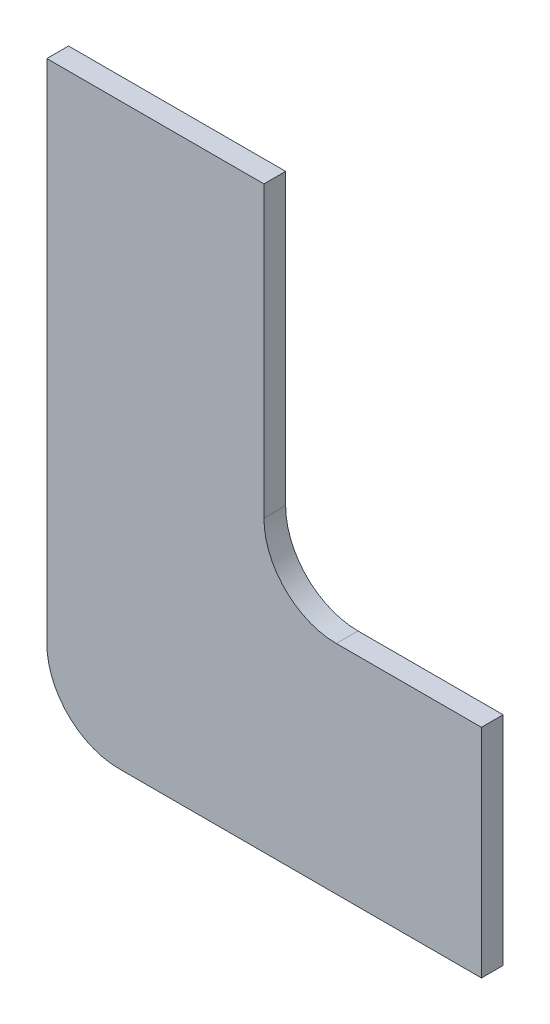
ISO-10303-21;
HEADER;
FILE_DESCRIPTION(('STEP AP214'),'2;1');
FILE_NAME('part.step','',(''),(''),'','','');
FILE_SCHEMA(('AUTOMOTIVE_DESIGN { 1 0 10303 214 1 1 1 1 }'));
ENDSEC;
DATA;
#1=APPLICATION_CONTEXT('core data for automotive mechanical design processes');
#2=APPLICATION_PROTOCOL_DEFINITION('international standard','automotive_design',2000,#1);
#3=PRODUCT_CONTEXT('',#1,'mechanical');
#4=PRODUCT('Part','Part','',(#3));
#5=PRODUCT_RELATED_PRODUCT_CATEGORY('part','',(#4));
#6=PRODUCT_DEFINITION_FORMATION('','',#4);
#7=PRODUCT_DEFINITION_CONTEXT('part definition',#1,'design');
#8=PRODUCT_DEFINITION('design','',#6,#7);
#9=PRODUCT_DEFINITION_SHAPE('','',#8);
#10=(LENGTH_UNIT() NAMED_UNIT(*) SI_UNIT(.MILLI.,.METRE.));
#11=(NAMED_UNIT(*) PLANE_ANGLE_UNIT() SI_UNIT($,.RADIAN.));
#12=(NAMED_UNIT(*) SI_UNIT($,.STERADIAN.) SOLID_ANGLE_UNIT());
#13=UNCERTAINTY_MEASURE_WITH_UNIT(LENGTH_MEASURE(1.E-05),#10,'distance_accuracy_value','');
#14=(GEOMETRIC_REPRESENTATION_CONTEXT(3) GLOBAL_UNCERTAINTY_ASSIGNED_CONTEXT((#13)) GLOBAL_UNIT_ASSIGNED_CONTEXT((#10,
#11,#12)) REPRESENTATION_CONTEXT('',''));
#15=CARTESIAN_POINT('',(0.,0.,0.));
#16=DIRECTION('',(0.,0.,1.));
#17=DIRECTION('',(1.,0.,0.));
#18=AXIS2_PLACEMENT_3D('',#15,#16,#17);
#19=CARTESIAN_POINT('',(0.15,-0.4,0.015));
#20=DIRECTION('',(0.,1.,0.));
#21=DIRECTION('',(0.,0.,1.));
#22=AXIS2_PLACEMENT_3D('',#19,#20,#21);
#23=PLANE('',#22);
#24=DIRECTION('',(1.,0.,0.));
#25=VECTOR('',#24,1.);
#26=CARTESIAN_POINT('',(0.15,-0.4,-0.015));
#27=LINE('',#26,#25);
#28=CARTESIAN_POINT('',(-0.0499999999999992,-0.4,-0.015));
#29=VERTEX_POINT('',#28);
#30=CARTESIAN_POINT('',(0.450569691035873,-0.4,-0.015));
#31=VERTEX_POINT('',#30);
#32=EDGE_CURVE('E83',#29,#31,#27,.T.);
#33=ORIENTED_EDGE('',*,*,#32,.T.);
#34=DIRECTION('',(0.,0.,-1.));
#35=VECTOR('',#34,1.);
#36=CARTESIAN_POINT('',(0.450569691035873,-0.4,0.015));
#37=LINE('',#36,#35);
#38=CARTESIAN_POINT('',(0.450569691035873,-0.4,0.015));
#39=VERTEX_POINT('',#38);
#40=EDGE_CURVE('E11',#39,#31,#37,.T.);
#41=ORIENTED_EDGE('',*,*,#40,.F.);
#42=DIRECTION('',(1.,0.,0.));
#43=VECTOR('',#42,1.);
#44=CARTESIAN_POINT('',(-0.0499999999999992,-0.4,0.015));
#45=LINE('',#44,#43);
#46=CARTESIAN_POINT('',(-0.0499999999999992,-0.4,0.015));
#47=VERTEX_POINT('',#46);
#48=EDGE_CURVE('E90',#47,#39,#45,.T.);
#49=ORIENTED_EDGE('',*,*,#48,.F.);
#50=DIRECTION('',(0.,0.,-1.));
#51=VECTOR('',#50,1.);
#52=CARTESIAN_POINT('',(-0.0499999999999992,-0.4,0.015));
#53=LINE('',#52,#51);
#54=EDGE_CURVE('E49',#47,#29,#53,.T.);
#55=ORIENTED_EDGE('',*,*,#54,.T.);
#56=EDGE_LOOP('',(#33,#41,#49,#55));
#57=FACE_BOUND('',#56,.T.);
#58=ADVANCED_FACE('F33',(#57),#23,.F.);
#59=CARTESIAN_POINT('',(0.450569691035873,-0.4,0.015));
#60=DIRECTION('',(-1.,0.,0.));
#61=DIRECTION('',(0.,0.,1.));
#62=AXIS2_PLACEMENT_3D('',#59,#60,#61);
#63=PLANE('',#62);
#64=DIRECTION('',(0.,1.,0.));
#65=VECTOR('',#64,1.);
#66=CARTESIAN_POINT('',(0.450569691035873,-0.4,-0.015));
#67=LINE('',#66,#65);
#68=CARTESIAN_POINT('',(0.450569691035873,-0.0999999999999999,-0.015));
#69=VERTEX_POINT('',#68);
#70=EDGE_CURVE('E132',#31,#69,#67,.T.);
#71=ORIENTED_EDGE('',*,*,#70,.T.);
#72=DIRECTION('',(0.,0.,-1.));
#73=VECTOR('',#72,1.);
#74=CARTESIAN_POINT('',(0.450569691035873,-0.0999999999999999,0.015));
#75=LINE('',#74,#73);
#76=CARTESIAN_POINT('',(0.450569691035873,-0.0999999999999999,0.015));
#77=VERTEX_POINT('',#76);
#78=EDGE_CURVE('E41',#77,#69,#75,.T.);
#79=ORIENTED_EDGE('',*,*,#78,.F.);
#80=DIRECTION('',(0.,1.,0.));
#81=VECTOR('',#80,1.);
#82=CARTESIAN_POINT('',(0.450569691035873,-0.4,0.015));
#83=LINE('',#82,#81);
#84=EDGE_CURVE('E172',#39,#77,#83,.T.);
#85=ORIENTED_EDGE('',*,*,#84,.F.);
#86=ORIENTED_EDGE('',*,*,#40,.T.);
#87=EDGE_LOOP('',(#71,#79,#85,#86));
#88=FACE_BOUND('',#87,.T.);
#89=ADVANCED_FACE('F164',(#88),#63,.F.);
#90=CARTESIAN_POINT('',(0.250000000000001,-0.0999999999999999,0.015));
#91=DIRECTION('',(0.,1.,0.));
#92=DIRECTION('',(0.,0.,1.));
#93=AXIS2_PLACEMENT_3D('',#90,#91,#92);
#94=PLANE('',#93);
#95=DIRECTION('',(1.,0.,0.));
#96=VECTOR('',#95,1.);
#97=CARTESIAN_POINT('',(0.250000000000001,-0.0999999999999999,-0.015));
#98=LINE('',#97,#96);
#99=CARTESIAN_POINT('',(0.250000000000001,-0.0999999999999999,-0.015));
#100=VERTEX_POINT('',#99);
#101=EDGE_CURVE('E135',#100,#69,#98,.T.);
#102=ORIENTED_EDGE('',*,*,#101,.F.);
#103=DIRECTION('',(0.,0.,-1.));
#104=VECTOR('',#103,1.);
#105=CARTESIAN_POINT('',(0.250000000000001,-0.0999999999999999,0.015));
#106=LINE('',#105,#104);
#107=CARTESIAN_POINT('',(0.250000000000001,-0.0999999999999999,0.015));
#108=VERTEX_POINT('',#107);
#109=EDGE_CURVE('E154',#108,#100,#106,.T.);
#110=ORIENTED_EDGE('',*,*,#109,.F.);
#111=DIRECTION('',(1.,0.,0.));
#112=VECTOR('',#111,1.);
#113=CARTESIAN_POINT('',(0.250000000000001,-0.0999999999999999,0.015));
#114=LINE('',#113,#112);
#115=EDGE_CURVE('E161',#108,#77,#114,.T.);
#116=ORIENTED_EDGE('',*,*,#115,.T.);
#117=ORIENTED_EDGE('',*,*,#78,.T.);
#118=EDGE_LOOP('',(#102,#110,#116,#117));
#119=FACE_BOUND('',#118,.T.);
#120=ADVANCED_FACE('F159',(#119),#94,.T.);
#121=CARTESIAN_POINT('',(0.25,0.,0.015));
#122=DIRECTION('',(0.,0.,-1.));
#123=DIRECTION('',(-1.,0.,0.));
#124=AXIS2_PLACEMENT_3D('',#121,#122,#123);
#125=CYLINDRICAL_SURFACE('',#124,0.1);
#126=CARTESIAN_POINT('',(0.25,0.,-0.015));
#127=DIRECTION('',(0.,0.,-1.));
#128=DIRECTION('',(-1.,0.,0.));
#129=AXIS2_PLACEMENT_3D('',#126,#127,#128);
#130=CIRCLE('',#129,0.1);
#131=CARTESIAN_POINT('',(0.15,0.,-0.015));
#132=VERTEX_POINT('',#131);
#133=EDGE_CURVE('E138',#100,#132,#130,.T.);
#134=ORIENTED_EDGE('',*,*,#133,.T.);
#135=DIRECTION('',(0.,0.,-1.));
#136=VECTOR('',#135,1.);
#137=CARTESIAN_POINT('',(0.15,0.,0.015));
#138=LINE('',#137,#136);
#139=CARTESIAN_POINT('',(0.15,0.,0.015));
#140=VERTEX_POINT('',#139);
#141=EDGE_CURVE('E152',#140,#132,#138,.T.);
#142=ORIENTED_EDGE('',*,*,#141,.F.);
#143=CARTESIAN_POINT('',(0.25,0.,0.015));
#144=DIRECTION('',(0.,0.,-1.));
#145=DIRECTION('',(-1.,0.,0.));
#146=AXIS2_PLACEMENT_3D('',#143,#144,#145);
#147=CIRCLE('',#146,0.1);
#148=EDGE_CURVE('E126',#108,#140,#147,.T.);
#149=ORIENTED_EDGE('',*,*,#148,.F.);
#150=ORIENTED_EDGE('',*,*,#109,.T.);
#151=EDGE_LOOP('',(#134,#142,#149,#150));
#152=FACE_BOUND('',#151,.T.);
#153=ADVANCED_FACE('F170',(#152),#125,.F.);
#154=CARTESIAN_POINT('',(0.15,0.4,0.015));
#155=DIRECTION('',(1.,0.,0.));
#156=DIRECTION('',(0.,1.,0.));
#157=AXIS2_PLACEMENT_3D('',#154,#155,#156);
#158=PLANE('',#157);
#159=DIRECTION('',(0.,-1.,0.));
#160=VECTOR('',#159,1.);
#161=CARTESIAN_POINT('',(0.15,0.4,-0.015));
#162=LINE('',#161,#160);
#163=CARTESIAN_POINT('',(0.15,0.4,-0.015));
#164=VERTEX_POINT('',#163);
#165=EDGE_CURVE('E141',#164,#132,#162,.T.);
#166=ORIENTED_EDGE('',*,*,#165,.F.);
#167=DIRECTION('',(0.,0.,-1.));
#168=VECTOR('',#167,1.);
#169=CARTESIAN_POINT('',(0.15,0.4,0.015));
#170=LINE('',#169,#168);
#171=CARTESIAN_POINT('',(0.15,0.4,0.015));
#172=VERTEX_POINT('',#171);
#173=EDGE_CURVE('E115',#172,#164,#170,.T.);
#174=ORIENTED_EDGE('',*,*,#173,.F.);
#175=DIRECTION('',(0.,-1.,0.));
#176=VECTOR('',#175,1.);
#177=CARTESIAN_POINT('',(0.15,0.4,0.015));
#178=LINE('',#177,#176);
#179=EDGE_CURVE('E124',#172,#140,#178,.T.);
#180=ORIENTED_EDGE('',*,*,#179,.T.);
#181=ORIENTED_EDGE('',*,*,#141,.T.);
#182=EDGE_LOOP('',(#166,#174,#180,#181));
#183=FACE_BOUND('',#182,.T.);
#184=ADVANCED_FACE('F177',(#183),#158,.T.);
#185=CARTESIAN_POINT('',(-0.15,0.4,0.015));
#186=DIRECTION('',(0.,1.,0.));
#187=DIRECTION('',(0.,0.,1.));
#188=AXIS2_PLACEMENT_3D('',#185,#186,#187);
#189=PLANE('',#188);
#190=DIRECTION('',(1.,0.,0.));
#191=VECTOR('',#190,1.);
#192=CARTESIAN_POINT('',(-0.15,0.4,-0.015));
#193=LINE('',#192,#191);
#194=CARTESIAN_POINT('',(-0.15,0.4,-0.015));
#195=VERTEX_POINT('',#194);
#196=EDGE_CURVE('E112',#195,#164,#193,.T.);
#197=ORIENTED_EDGE('',*,*,#196,.F.);
#198=DIRECTION('',(0.,0.,-1.));
#199=VECTOR('',#198,1.);
#200=CARTESIAN_POINT('',(-0.15,0.4,0.015));
#201=LINE('',#200,#199);
#202=CARTESIAN_POINT('',(-0.15,0.4,0.015));
#203=VERTEX_POINT('',#202);
#204=EDGE_CURVE('E106',#203,#195,#201,.T.);
#205=ORIENTED_EDGE('',*,*,#204,.F.);
#206=DIRECTION('',(1.,0.,0.));
#207=VECTOR('',#206,1.);
#208=CARTESIAN_POINT('',(-0.15,0.4,0.015));
#209=LINE('',#208,#207);
#210=EDGE_CURVE('E110',#203,#172,#209,.T.);
#211=ORIENTED_EDGE('',*,*,#210,.T.);
#212=ORIENTED_EDGE('',*,*,#173,.T.);
#213=EDGE_LOOP('',(#197,#205,#211,#212));
#214=FACE_BOUND('',#213,.T.);
#215=ADVANCED_FACE('F108',(#214),#189,.T.);
#216=CARTESIAN_POINT('',(-0.15,0.4,0.015));
#217=DIRECTION('',(1.,0.,0.));
#218=DIRECTION('',(0.,1.,0.));
#219=AXIS2_PLACEMENT_3D('',#216,#217,#218);
#220=PLANE('',#219);
#221=DIRECTION('',(0.,-1.,0.));
#222=VECTOR('',#221,1.);
#223=CARTESIAN_POINT('',(-0.15,0.4,-0.015));
#224=LINE('',#223,#222);
#225=CARTESIAN_POINT('',(-0.15,-0.299999999999999,-0.015));
#226=VERTEX_POINT('',#225);
#227=EDGE_CURVE('E145',#195,#226,#224,.T.);
#228=ORIENTED_EDGE('',*,*,#227,.T.);
#229=DIRECTION('',(0.,0.,-1.));
#230=VECTOR('',#229,1.);
#231=CARTESIAN_POINT('',(-0.15,-0.299999999999999,0.015));
#232=LINE('',#231,#230);
#233=CARTESIAN_POINT('',(-0.15,-0.299999999999999,0.015));
#234=VERTEX_POINT('',#233);
#235=EDGE_CURVE('E76',#234,#226,#232,.T.);
#236=ORIENTED_EDGE('',*,*,#235,.F.);
#237=DIRECTION('',(0.,-1.,0.));
#238=VECTOR('',#237,1.);
#239=CARTESIAN_POINT('',(-0.15,0.4,0.015));
#240=LINE('',#239,#238);
#241=EDGE_CURVE('E117',#203,#234,#240,.T.);
#242=ORIENTED_EDGE('',*,*,#241,.F.);
#243=ORIENTED_EDGE('',*,*,#204,.T.);
#244=EDGE_LOOP('',(#228,#236,#242,#243));
#245=FACE_BOUND('',#244,.T.);
#246=ADVANCED_FACE('F118',(#245),#220,.F.);
#247=CARTESIAN_POINT('',(-0.0499999999999999,-0.3,0.015));
#248=DIRECTION('',(0.,0.,-1.));
#249=DIRECTION('',(-1.,0.,0.));
#250=AXIS2_PLACEMENT_3D('',#247,#248,#249);
#251=CYLINDRICAL_SURFACE('',#250,0.1);
#252=CARTESIAN_POINT('',(-0.0499999999999999,-0.3,-0.015));
#253=DIRECTION('',(0.,0.,-1.));
#254=DIRECTION('',(-1.,0.,0.));
#255=AXIS2_PLACEMENT_3D('',#252,#253,#254);
#256=CIRCLE('',#255,0.1);
#257=EDGE_CURVE('E147',#29,#226,#256,.T.);
#258=ORIENTED_EDGE('',*,*,#257,.F.);
#259=ORIENTED_EDGE('',*,*,#54,.F.);
#260=CARTESIAN_POINT('',(-0.0499999999999999,-0.3,0.015));
#261=DIRECTION('',(0.,0.,-1.));
#262=DIRECTION('',(-1.,0.,0.));
#263=AXIS2_PLACEMENT_3D('',#260,#261,#262);
#264=CIRCLE('',#263,0.1);
#265=EDGE_CURVE('E119',#47,#234,#264,.T.);
#266=ORIENTED_EDGE('',*,*,#265,.T.);
#267=ORIENTED_EDGE('',*,*,#235,.T.);
#268=EDGE_LOOP('',(#258,#259,#266,#267));
#269=FACE_BOUND('',#268,.T.);
#270=ADVANCED_FACE('F178',(#269),#251,.T.);
#271=CARTESIAN_POINT('',(0.25,0.,0.015));
#272=DIRECTION('',(0.,0.,-1.));
#273=DIRECTION('',(-1.,0.,0.));
#274=AXIS2_PLACEMENT_3D('',#271,#272,#273);
#275=PLANE('',#274);
#276=ORIENTED_EDGE('',*,*,#48,.T.);
#277=ORIENTED_EDGE('',*,*,#84,.T.);
#278=ORIENTED_EDGE('',*,*,#115,.F.);
#279=ORIENTED_EDGE('',*,*,#148,.T.);
#280=ORIENTED_EDGE('',*,*,#179,.F.);
#281=ORIENTED_EDGE('',*,*,#210,.F.);
#282=ORIENTED_EDGE('',*,*,#241,.T.);
#283=ORIENTED_EDGE('',*,*,#265,.F.);
#284=EDGE_LOOP('',(#276,#277,#278,#279,#280,#281,#282,#283));
#285=FACE_BOUND('',#284,.T.);
#286=ADVANCED_FACE('F122',(#285),#275,.F.);
#287=CARTESIAN_POINT('',(0.25,0.,-0.015));
#288=DIRECTION('',(0.,0.,-1.));
#289=DIRECTION('',(-1.,0.,0.));
#290=AXIS2_PLACEMENT_3D('',#287,#288,#289);
#291=PLANE('',#290);
#292=ORIENTED_EDGE('',*,*,#32,.F.);
#293=ORIENTED_EDGE('',*,*,#257,.T.);
#294=ORIENTED_EDGE('',*,*,#227,.F.);
#295=ORIENTED_EDGE('',*,*,#196,.T.);
#296=ORIENTED_EDGE('',*,*,#165,.T.);
#297=ORIENTED_EDGE('',*,*,#133,.F.);
#298=ORIENTED_EDGE('',*,*,#101,.T.);
#299=ORIENTED_EDGE('',*,*,#70,.F.);
#300=EDGE_LOOP('',(#292,#293,#294,#295,#296,#297,#298,#299));
#301=FACE_BOUND('',#300,.T.);
#302=ADVANCED_FACE('F166',(#301),#291,.T.);
#303=CLOSED_SHELL('',(#58,#89,#120,#153,#184,#215,#246,#270,#286,#302));
#304=MANIFOLD_SOLID_BREP('B2',#303);
#305=ADVANCED_BREP_SHAPE_REPRESENTATION('',(#18,#304),#14);
#306=SHAPE_DEFINITION_REPRESENTATION(#9,#305);
ENDSEC;
END-ISO-10303-21;
